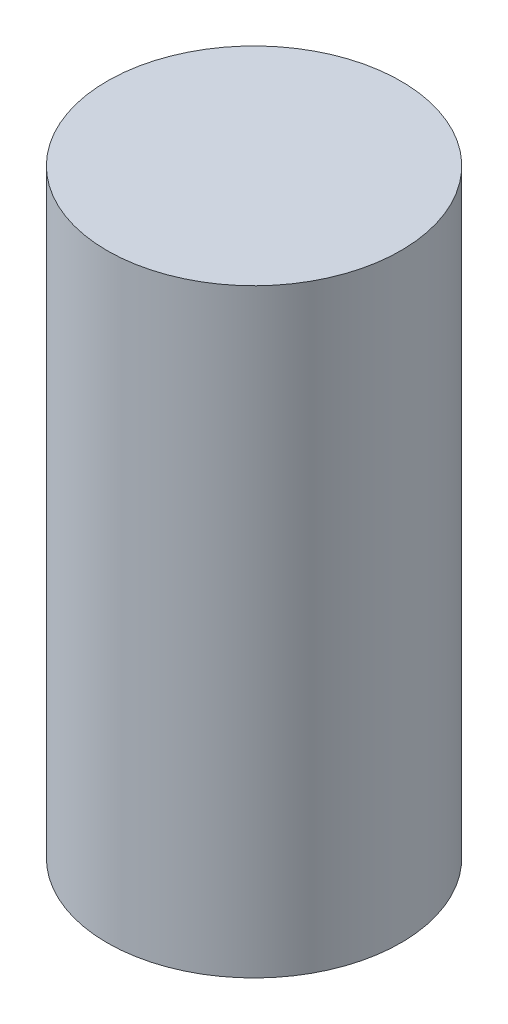
ISO-10303-21;
HEADER;
FILE_DESCRIPTION(('STEP AP214'),'2;1');
FILE_NAME('part.step','',(''),(''),'','','');
FILE_SCHEMA(('AUTOMOTIVE_DESIGN { 1 0 10303 214 1 1 1 1 }'));
ENDSEC;
DATA;
#1=APPLICATION_CONTEXT('core data for automotive mechanical design processes');
#2=APPLICATION_PROTOCOL_DEFINITION('international standard','automotive_design',2000,#1);
#3=PRODUCT_CONTEXT('',#1,'mechanical');
#4=PRODUCT('Part','Part','',(#3));
#5=PRODUCT_RELATED_PRODUCT_CATEGORY('part','',(#4));
#6=PRODUCT_DEFINITION_FORMATION('','',#4);
#7=PRODUCT_DEFINITION_CONTEXT('part definition',#1,'design');
#8=PRODUCT_DEFINITION('design','',#6,#7);
#9=PRODUCT_DEFINITION_SHAPE('','',#8);
#10=(LENGTH_UNIT() NAMED_UNIT(*) SI_UNIT(.MILLI.,.METRE.));
#11=(NAMED_UNIT(*) PLANE_ANGLE_UNIT() SI_UNIT($,.RADIAN.));
#12=(NAMED_UNIT(*) SI_UNIT($,.STERADIAN.) SOLID_ANGLE_UNIT());
#13=UNCERTAINTY_MEASURE_WITH_UNIT(LENGTH_MEASURE(1.E-05),#10,'distance_accuracy_value','');
#14=(GEOMETRIC_REPRESENTATION_CONTEXT(3) GLOBAL_UNCERTAINTY_ASSIGNED_CONTEXT((#13)) GLOBAL_UNIT_ASSIGNED_CONTEXT((#10,
#11,#12)) REPRESENTATION_CONTEXT('',''));
#15=CARTESIAN_POINT('',(0.,0.,0.));
#16=DIRECTION('',(0.,0.,1.));
#17=DIRECTION('',(1.,0.,0.));
#18=AXIS2_PLACEMENT_3D('',#15,#16,#17);
#19=CARTESIAN_POINT('',(0.,20.,0.));
#20=DIRECTION('',(0.,-1.,0.));
#21=DIRECTION('',(0.,0.,-1.));
#22=AXIS2_PLACEMENT_3D('',#19,#20,#21);
#23=CYLINDRICAL_SURFACE('',#22,4.9);
#24=CARTESIAN_POINT('',(0.,20.,0.));
#25=DIRECTION('',(0.,1.,0.));
#26=DIRECTION('',(0.,0.,1.));
#27=AXIS2_PLACEMENT_3D('',#24,#25,#26);
#28=CIRCLE('',#27,4.9);
#29=CARTESIAN_POINT('',(0.,20.,4.9));
#30=VERTEX_POINT('',#29);
#31=EDGE_CURVE('E10',#30,#30,#28,.T.);
#32=ORIENTED_EDGE('',*,*,#31,.F.);
#33=EDGE_LOOP('',(#32));
#34=FACE_BOUND('',#33,.T.);
#35=CARTESIAN_POINT('',(0.,0.,0.));
#36=DIRECTION('',(0.,1.,0.));
#37=DIRECTION('',(0.,0.,1.));
#38=AXIS2_PLACEMENT_3D('',#35,#36,#37);
#39=CIRCLE('',#38,4.9);
#40=CARTESIAN_POINT('',(0.,0.,4.9));
#41=VERTEX_POINT('',#40);
#42=EDGE_CURVE('E34',#41,#41,#39,.T.);
#43=ORIENTED_EDGE('',*,*,#42,.T.);
#44=EDGE_LOOP('',(#43));
#45=FACE_BOUND('',#44,.T.);
#46=ADVANCED_FACE('F31',(#34,#45),#23,.T.);
#47=CARTESIAN_POINT('',(0.,20.,0.));
#48=DIRECTION('',(0.,1.,0.));
#49=DIRECTION('',(0.,0.,1.));
#50=AXIS2_PLACEMENT_3D('',#47,#48,#49);
#51=PLANE('',#50);
#52=ORIENTED_EDGE('',*,*,#31,.T.);
#53=EDGE_LOOP('',(#52));
#54=FACE_BOUND('',#53,.T.);
#55=ADVANCED_FACE('F46',(#54),#51,.T.);
#56=CARTESIAN_POINT('',(0.,0.,0.));
#57=DIRECTION('',(0.,1.,0.));
#58=DIRECTION('',(0.,0.,1.));
#59=AXIS2_PLACEMENT_3D('',#56,#57,#58);
#60=PLANE('',#59);
#61=ORIENTED_EDGE('',*,*,#42,.F.);
#62=EDGE_LOOP('',(#61));
#63=FACE_BOUND('',#62,.T.);
#64=ADVANCED_FACE('F44',(#63),#60,.F.);
#65=CLOSED_SHELL('',(#46,#55,#64));
#66=MANIFOLD_SOLID_BREP('B2',#65);
#67=ADVANCED_BREP_SHAPE_REPRESENTATION('',(#18,#66),#14);
#68=SHAPE_DEFINITION_REPRESENTATION(#9,#67);
ENDSEC;
END-ISO-10303-21;
